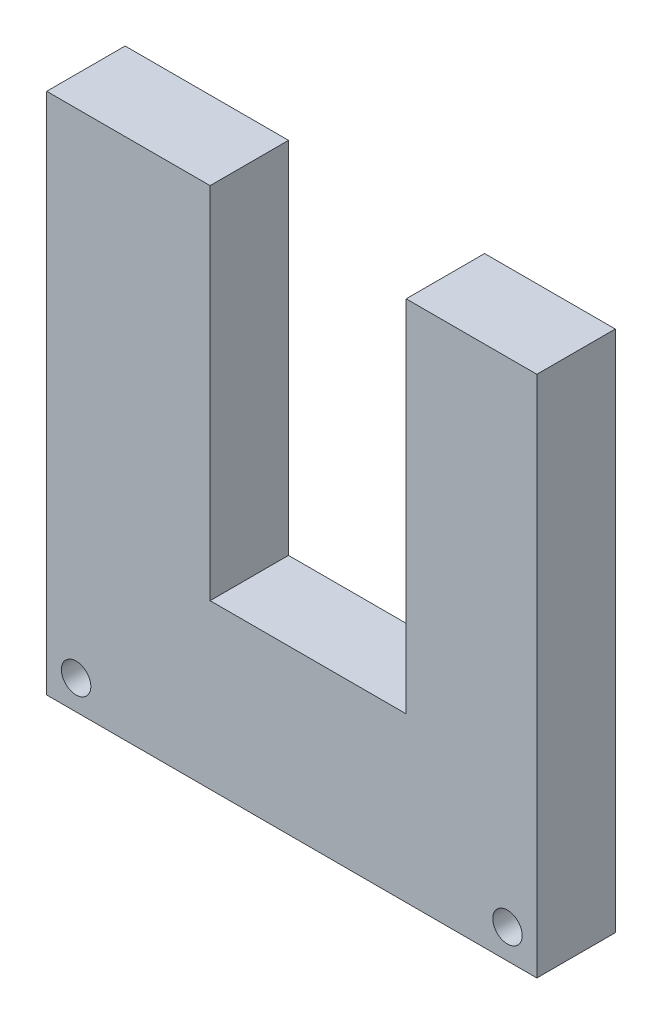
ISO-10303-21;
HEADER;
FILE_DESCRIPTION(('STEP AP214'),'2;1');
FILE_NAME('part.step','',(''),(''),'','','');
FILE_SCHEMA(('AUTOMOTIVE_DESIGN { 1 0 10303 214 1 1 1 1 }'));
ENDSEC;
DATA;
#1=APPLICATION_CONTEXT('core data for automotive mechanical design processes');
#2=APPLICATION_PROTOCOL_DEFINITION('international standard','automotive_design',2000,#1);
#3=PRODUCT_CONTEXT('',#1,'mechanical');
#4=PRODUCT('Part','Part','',(#3));
#5=PRODUCT_RELATED_PRODUCT_CATEGORY('part','',(#4));
#6=PRODUCT_DEFINITION_FORMATION('','',#4);
#7=PRODUCT_DEFINITION_CONTEXT('part definition',#1,'design');
#8=PRODUCT_DEFINITION('design','',#6,#7);
#9=PRODUCT_DEFINITION_SHAPE('','',#8);
#10=(LENGTH_UNIT() NAMED_UNIT(*) SI_UNIT(.MILLI.,.METRE.));
#11=(NAMED_UNIT(*) PLANE_ANGLE_UNIT() SI_UNIT($,.RADIAN.));
#12=(NAMED_UNIT(*) SI_UNIT($,.STERADIAN.) SOLID_ANGLE_UNIT());
#13=UNCERTAINTY_MEASURE_WITH_UNIT(LENGTH_MEASURE(1.E-05),#10,'distance_accuracy_value','');
#14=(GEOMETRIC_REPRESENTATION_CONTEXT(3) GLOBAL_UNCERTAINTY_ASSIGNED_CONTEXT((#13)) GLOBAL_UNIT_ASSIGNED_CONTEXT((#10,
#11,#12)) REPRESENTATION_CONTEXT('',''));
#15=CARTESIAN_POINT('',(0.,0.,0.));
#16=DIRECTION('',(0.,0.,1.));
#17=DIRECTION('',(1.,0.,0.));
#18=AXIS2_PLACEMENT_3D('',#15,#16,#17);
#19=CARTESIAN_POINT('',(0.,0.,12.));
#20=DIRECTION('',(0.,0.,-1.));
#21=DIRECTION('',(-1.,0.,0.));
#22=AXIS2_PLACEMENT_3D('',#19,#20,#21);
#23=PLANE('',#22);
#24=CARTESIAN_POINT('',(70.5,4.49999999999999,12.));
#25=DIRECTION('',(0.,0.,1.));
#26=DIRECTION('',(1.,0.,0.));
#27=AXIS2_PLACEMENT_3D('',#24,#25,#26);
#28=CIRCLE('',#27,2.25);
#29=CARTESIAN_POINT('',(72.75,4.49999999999999,12.));
#30=VERTEX_POINT('',#29);
#31=EDGE_CURVE('E134',#30,#30,#28,.T.);
#32=ORIENTED_EDGE('',*,*,#31,.F.);
#33=EDGE_LOOP('',(#32));
#34=FACE_BOUND('',#33,.T.);
#35=DIRECTION('',(1.,0.,0.));
#36=VECTOR('',#35,1.);
#37=CARTESIAN_POINT('',(75.,0.,12.));
#38=LINE('',#37,#36);
#39=CARTESIAN_POINT('',(0.,0.,12.));
#40=VERTEX_POINT('',#39);
#41=CARTESIAN_POINT('',(75.,0.,12.));
#42=VERTEX_POINT('',#41);
#43=EDGE_CURVE('E145',#40,#42,#38,.T.);
#44=ORIENTED_EDGE('',*,*,#43,.T.);
#45=DIRECTION('',(0.,1.,0.));
#46=VECTOR('',#45,1.);
#47=CARTESIAN_POINT('',(75.,80.,12.));
#48=LINE('',#47,#46);
#49=CARTESIAN_POINT('',(75.,80.,12.));
#50=VERTEX_POINT('',#49);
#51=EDGE_CURVE('E93',#42,#50,#48,.T.);
#52=ORIENTED_EDGE('',*,*,#51,.T.);
#53=DIRECTION('',(-1.,0.,0.));
#54=VECTOR('',#53,1.);
#55=CARTESIAN_POINT('',(55.,80.,12.));
#56=LINE('',#55,#54);
#57=CARTESIAN_POINT('',(55.,80.,12.));
#58=VERTEX_POINT('',#57);
#59=EDGE_CURVE('E160',#50,#58,#56,.T.);
#60=ORIENTED_EDGE('',*,*,#59,.T.);
#61=DIRECTION('',(0.,-1.,0.));
#62=VECTOR('',#61,1.);
#63=CARTESIAN_POINT('',(55.,25.,12.));
#64=LINE('',#63,#62);
#65=CARTESIAN_POINT('',(55.,25.,12.));
#66=VERTEX_POINT('',#65);
#67=EDGE_CURVE('E173',#58,#66,#64,.T.);
#68=ORIENTED_EDGE('',*,*,#67,.T.);
#69=DIRECTION('',(-1.,0.,0.));
#70=VECTOR('',#69,1.);
#71=CARTESIAN_POINT('',(25.,25.,12.));
#72=LINE('',#71,#70);
#73=CARTESIAN_POINT('',(25.,25.,12.));
#74=VERTEX_POINT('',#73);
#75=EDGE_CURVE('E112',#66,#74,#72,.T.);
#76=ORIENTED_EDGE('',*,*,#75,.T.);
#77=DIRECTION('',(0.,1.,0.));
#78=VECTOR('',#77,1.);
#79=CARTESIAN_POINT('',(25.,80.,12.));
#80=LINE('',#79,#78);
#81=CARTESIAN_POINT('',(25.,80.,12.));
#82=VERTEX_POINT('',#81);
#83=EDGE_CURVE('E106',#74,#82,#80,.T.);
#84=ORIENTED_EDGE('',*,*,#83,.T.);
#85=DIRECTION('',(-1.,0.,0.));
#86=VECTOR('',#85,1.);
#87=CARTESIAN_POINT('',(0.,80.,12.));
#88=LINE('',#87,#86);
#89=CARTESIAN_POINT('',(0.,80.,12.));
#90=VERTEX_POINT('',#89);
#91=EDGE_CURVE('E110',#82,#90,#88,.T.);
#92=ORIENTED_EDGE('',*,*,#91,.T.);
#93=DIRECTION('',(0.,-1.,0.));
#94=VECTOR('',#93,1.);
#95=CARTESIAN_POINT('',(0.,0.,12.));
#96=LINE('',#95,#94);
#97=EDGE_CURVE('E50',#90,#40,#96,.T.);
#98=ORIENTED_EDGE('',*,*,#97,.T.);
#99=EDGE_LOOP('',(#44,#52,#60,#68,#76,#84,#92,#98));
#100=FACE_BOUND('',#99,.T.);
#101=CARTESIAN_POINT('',(4.5,4.49999999999999,12.));
#102=DIRECTION('',(0.,0.,1.));
#103=DIRECTION('',(1.,0.,0.));
#104=AXIS2_PLACEMENT_3D('',#101,#102,#103);
#105=CIRCLE('',#104,2.25);
#106=CARTESIAN_POINT('',(6.75,4.49999999999999,12.));
#107=VERTEX_POINT('',#106);
#108=EDGE_CURVE('E182',#107,#107,#105,.T.);
#109=ORIENTED_EDGE('',*,*,#108,.F.);
#110=EDGE_LOOP('',(#109));
#111=FACE_BOUND('',#110,.T.);
#112=ADVANCED_FACE('F33',(#34,#100,#111),#23,.F.);
#113=CARTESIAN_POINT('',(0.,0.,0.));
#114=DIRECTION('',(0.,0.,-1.));
#115=DIRECTION('',(-1.,0.,0.));
#116=AXIS2_PLACEMENT_3D('',#113,#114,#115);
#117=PLANE('',#116);
#118=CARTESIAN_POINT('',(70.5,4.49999999999999,0.));
#119=DIRECTION('',(0.,0.,1.));
#120=DIRECTION('',(1.,0.,0.));
#121=AXIS2_PLACEMENT_3D('',#118,#119,#120);
#122=CIRCLE('',#121,2.25);
#123=CARTESIAN_POINT('',(72.75,4.49999999999999,0.));
#124=VERTEX_POINT('',#123);
#125=EDGE_CURVE('E179',#124,#124,#122,.T.);
#126=ORIENTED_EDGE('',*,*,#125,.T.);
#127=EDGE_LOOP('',(#126));
#128=FACE_BOUND('',#127,.T.);
#129=DIRECTION('',(1.,0.,0.));
#130=VECTOR('',#129,1.);
#131=CARTESIAN_POINT('',(75.,0.,0.));
#132=LINE('',#131,#130);
#133=CARTESIAN_POINT('',(0.,0.,0.));
#134=VERTEX_POINT('',#133);
#135=CARTESIAN_POINT('',(75.,0.,0.));
#136=VERTEX_POINT('',#135);
#137=EDGE_CURVE('E130',#134,#136,#132,.T.);
#138=ORIENTED_EDGE('',*,*,#137,.F.);
#139=DIRECTION('',(0.,-1.,0.));
#140=VECTOR('',#139,1.);
#141=CARTESIAN_POINT('',(0.,0.,0.));
#142=LINE('',#141,#140);
#143=CARTESIAN_POINT('',(0.,80.,0.));
#144=VERTEX_POINT('',#143);
#145=EDGE_CURVE('E85',#144,#134,#142,.T.);
#146=ORIENTED_EDGE('',*,*,#145,.F.);
#147=DIRECTION('',(-1.,0.,0.));
#148=VECTOR('',#147,1.);
#149=CARTESIAN_POINT('',(0.,80.,0.));
#150=LINE('',#149,#148);
#151=CARTESIAN_POINT('',(25.,80.,0.));
#152=VERTEX_POINT('',#151);
#153=EDGE_CURVE('E79',#152,#144,#150,.T.);
#154=ORIENTED_EDGE('',*,*,#153,.F.);
#155=DIRECTION('',(0.,1.,0.));
#156=VECTOR('',#155,1.);
#157=CARTESIAN_POINT('',(25.,80.,0.));
#158=LINE('',#157,#156);
#159=CARTESIAN_POINT('',(25.,25.,0.));
#160=VERTEX_POINT('',#159);
#161=EDGE_CURVE('E120',#160,#152,#158,.T.);
#162=ORIENTED_EDGE('',*,*,#161,.F.);
#163=DIRECTION('',(-1.,0.,0.));
#164=VECTOR('',#163,1.);
#165=CARTESIAN_POINT('',(25.,25.,0.));
#166=LINE('',#165,#164);
#167=CARTESIAN_POINT('',(55.,25.,0.));
#168=VERTEX_POINT('',#167);
#169=EDGE_CURVE('E140',#168,#160,#166,.T.);
#170=ORIENTED_EDGE('',*,*,#169,.F.);
#171=DIRECTION('',(0.,-1.,0.));
#172=VECTOR('',#171,1.);
#173=CARTESIAN_POINT('',(55.,25.,0.));
#174=LINE('',#173,#172);
#175=CARTESIAN_POINT('',(55.,80.,0.));
#176=VERTEX_POINT('',#175);
#177=EDGE_CURVE('E138',#176,#168,#174,.T.);
#178=ORIENTED_EDGE('',*,*,#177,.F.);
#179=DIRECTION('',(-1.,0.,0.));
#180=VECTOR('',#179,1.);
#181=CARTESIAN_POINT('',(55.,80.,0.));
#182=LINE('',#181,#180);
#183=CARTESIAN_POINT('',(75.,80.,0.));
#184=VERTEX_POINT('',#183);
#185=EDGE_CURVE('E136',#184,#176,#182,.T.);
#186=ORIENTED_EDGE('',*,*,#185,.F.);
#187=DIRECTION('',(0.,1.,0.));
#188=VECTOR('',#187,1.);
#189=CARTESIAN_POINT('',(75.,80.,0.));
#190=LINE('',#189,#188);
#191=EDGE_CURVE('E133',#136,#184,#190,.T.);
#192=ORIENTED_EDGE('',*,*,#191,.F.);
#193=EDGE_LOOP('',(#138,#146,#154,#162,#170,#178,#186,#192));
#194=FACE_BOUND('',#193,.T.);
#195=CARTESIAN_POINT('',(4.5,4.49999999999999,0.));
#196=DIRECTION('',(0.,0.,1.));
#197=DIRECTION('',(1.,0.,0.));
#198=AXIS2_PLACEMENT_3D('',#195,#196,#197);
#199=CIRCLE('',#198,2.25);
#200=CARTESIAN_POINT('',(6.75,4.49999999999999,0.));
#201=VERTEX_POINT('',#200);
#202=EDGE_CURVE('E185',#201,#201,#199,.T.);
#203=ORIENTED_EDGE('',*,*,#202,.T.);
#204=EDGE_LOOP('',(#203));
#205=FACE_BOUND('',#204,.T.);
#206=ADVANCED_FACE('F164',(#128,#194,#205),#117,.T.);
#207=CARTESIAN_POINT('',(75.,0.,12.));
#208=DIRECTION('',(0.,1.,0.));
#209=DIRECTION('',(-1.,0.,0.));
#210=AXIS2_PLACEMENT_3D('',#207,#208,#209);
#211=PLANE('',#210);
#212=ORIENTED_EDGE('',*,*,#137,.T.);
#213=DIRECTION('',(0.,0.,-1.));
#214=VECTOR('',#213,1.);
#215=CARTESIAN_POINT('',(75.,0.,12.));
#216=LINE('',#215,#214);
#217=EDGE_CURVE('E11',#42,#136,#216,.T.);
#218=ORIENTED_EDGE('',*,*,#217,.F.);
#219=ORIENTED_EDGE('',*,*,#43,.F.);
#220=DIRECTION('',(0.,0.,-1.));
#221=VECTOR('',#220,1.);
#222=CARTESIAN_POINT('',(0.,0.,12.));
#223=LINE('',#222,#221);
#224=EDGE_CURVE('E126',#40,#134,#223,.T.);
#225=ORIENTED_EDGE('',*,*,#224,.T.);
#226=EDGE_LOOP('',(#212,#218,#219,#225));
#227=FACE_BOUND('',#226,.T.);
#228=ADVANCED_FACE('F35',(#227),#211,.F.);
#229=CARTESIAN_POINT('',(75.,80.,12.));
#230=DIRECTION('',(-1.,0.,0.));
#231=DIRECTION('',(0.,-1.,0.));
#232=AXIS2_PLACEMENT_3D('',#229,#230,#231);
#233=PLANE('',#232);
#234=ORIENTED_EDGE('',*,*,#191,.T.);
#235=DIRECTION('',(0.,0.,-1.));
#236=VECTOR('',#235,1.);
#237=CARTESIAN_POINT('',(75.,80.,12.));
#238=LINE('',#237,#236);
#239=EDGE_CURVE('E42',#50,#184,#238,.T.);
#240=ORIENTED_EDGE('',*,*,#239,.F.);
#241=ORIENTED_EDGE('',*,*,#51,.F.);
#242=ORIENTED_EDGE('',*,*,#217,.T.);
#243=EDGE_LOOP('',(#234,#240,#241,#242));
#244=FACE_BOUND('',#243,.T.);
#245=ADVANCED_FACE('F218',(#244),#233,.F.);
#246=CARTESIAN_POINT('',(55.,80.,12.));
#247=DIRECTION('',(0.,-1.,0.));
#248=DIRECTION('',(0.,0.,-1.));
#249=AXIS2_PLACEMENT_3D('',#246,#247,#248);
#250=PLANE('',#249);
#251=ORIENTED_EDGE('',*,*,#185,.T.);
#252=DIRECTION('',(0.,0.,-1.));
#253=VECTOR('',#252,1.);
#254=CARTESIAN_POINT('',(55.,80.,12.));
#255=LINE('',#254,#253);
#256=EDGE_CURVE('E152',#58,#176,#255,.T.);
#257=ORIENTED_EDGE('',*,*,#256,.F.);
#258=ORIENTED_EDGE('',*,*,#59,.F.);
#259=ORIENTED_EDGE('',*,*,#239,.T.);
#260=EDGE_LOOP('',(#251,#257,#258,#259));
#261=FACE_BOUND('',#260,.T.);
#262=ADVANCED_FACE('F158',(#261),#250,.F.);
#263=CARTESIAN_POINT('',(55.,25.,12.));
#264=DIRECTION('',(1.,0.,0.));
#265=DIRECTION('',(0.,0.,-1.));
#266=AXIS2_PLACEMENT_3D('',#263,#264,#265);
#267=PLANE('',#266);
#268=ORIENTED_EDGE('',*,*,#177,.T.);
#269=DIRECTION('',(0.,0.,-1.));
#270=VECTOR('',#269,1.);
#271=CARTESIAN_POINT('',(55.,25.,12.));
#272=LINE('',#271,#270);
#273=EDGE_CURVE('E149',#66,#168,#272,.T.);
#274=ORIENTED_EDGE('',*,*,#273,.F.);
#275=ORIENTED_EDGE('',*,*,#67,.F.);
#276=ORIENTED_EDGE('',*,*,#256,.T.);
#277=EDGE_LOOP('',(#268,#274,#275,#276));
#278=FACE_BOUND('',#277,.T.);
#279=ADVANCED_FACE('F169',(#278),#267,.F.);
#280=CARTESIAN_POINT('',(25.,25.,12.));
#281=DIRECTION('',(0.,-1.,0.));
#282=DIRECTION('',(0.,0.,-1.));
#283=AXIS2_PLACEMENT_3D('',#280,#281,#282);
#284=PLANE('',#283);
#285=ORIENTED_EDGE('',*,*,#169,.T.);
#286=DIRECTION('',(0.,0.,-1.));
#287=VECTOR('',#286,1.);
#288=CARTESIAN_POINT('',(25.,25.,12.));
#289=LINE('',#288,#287);
#290=EDGE_CURVE('E121',#74,#160,#289,.T.);
#291=ORIENTED_EDGE('',*,*,#290,.F.);
#292=ORIENTED_EDGE('',*,*,#75,.F.);
#293=ORIENTED_EDGE('',*,*,#273,.T.);
#294=EDGE_LOOP('',(#285,#291,#292,#293));
#295=FACE_BOUND('',#294,.T.);
#296=ADVANCED_FACE('F172',(#295),#284,.F.);
#297=CARTESIAN_POINT('',(25.,80.,12.));
#298=DIRECTION('',(-1.,0.,0.));
#299=DIRECTION('',(0.,-1.,0.));
#300=AXIS2_PLACEMENT_3D('',#297,#298,#299);
#301=PLANE('',#300);
#302=ORIENTED_EDGE('',*,*,#161,.T.);
#303=DIRECTION('',(0.,0.,-1.));
#304=VECTOR('',#303,1.);
#305=CARTESIAN_POINT('',(25.,80.,12.));
#306=LINE('',#305,#304);
#307=EDGE_CURVE('E117',#82,#152,#306,.T.);
#308=ORIENTED_EDGE('',*,*,#307,.F.);
#309=ORIENTED_EDGE('',*,*,#83,.F.);
#310=ORIENTED_EDGE('',*,*,#290,.T.);
#311=EDGE_LOOP('',(#302,#308,#309,#310));
#312=FACE_BOUND('',#311,.T.);
#313=ADVANCED_FACE('F118',(#312),#301,.F.);
#314=CARTESIAN_POINT('',(0.,80.,12.));
#315=DIRECTION('',(0.,-1.,0.));
#316=DIRECTION('',(0.,0.,-1.));
#317=AXIS2_PLACEMENT_3D('',#314,#315,#316);
#318=PLANE('',#317);
#319=ORIENTED_EDGE('',*,*,#153,.T.);
#320=DIRECTION('',(0.,0.,-1.));
#321=VECTOR('',#320,1.);
#322=CARTESIAN_POINT('',(0.,80.,12.));
#323=LINE('',#322,#321);
#324=EDGE_CURVE('E122',#90,#144,#323,.T.);
#325=ORIENTED_EDGE('',*,*,#324,.F.);
#326=ORIENTED_EDGE('',*,*,#91,.F.);
#327=ORIENTED_EDGE('',*,*,#307,.T.);
#328=EDGE_LOOP('',(#319,#325,#326,#327));
#329=FACE_BOUND('',#328,.T.);
#330=ADVANCED_FACE('F124',(#329),#318,.F.);
#331=CARTESIAN_POINT('',(0.,0.,12.));
#332=DIRECTION('',(1.,0.,0.));
#333=DIRECTION('',(0.,0.,-1.));
#334=AXIS2_PLACEMENT_3D('',#331,#332,#333);
#335=PLANE('',#334);
#336=ORIENTED_EDGE('',*,*,#145,.T.);
#337=ORIENTED_EDGE('',*,*,#224,.F.);
#338=ORIENTED_EDGE('',*,*,#97,.F.);
#339=ORIENTED_EDGE('',*,*,#324,.T.);
#340=EDGE_LOOP('',(#336,#337,#338,#339));
#341=FACE_BOUND('',#340,.T.);
#342=ADVANCED_FACE('F206',(#341),#335,.F.);
#343=CARTESIAN_POINT('',(70.5,4.49999999999999,12.));
#344=DIRECTION('',(0.,0.,-1.));
#345=DIRECTION('',(-1.,0.,0.));
#346=AXIS2_PLACEMENT_3D('',#343,#344,#345);
#347=CYLINDRICAL_SURFACE('',#346,2.25);
#348=ORIENTED_EDGE('',*,*,#31,.T.);
#349=EDGE_LOOP('',(#348));
#350=FACE_BOUND('',#349,.T.);
#351=ORIENTED_EDGE('',*,*,#125,.F.);
#352=EDGE_LOOP('',(#351));
#353=FACE_BOUND('',#352,.T.);
#354=ADVANCED_FACE('F203',(#350,#353),#347,.F.);
#355=CARTESIAN_POINT('',(4.5,4.49999999999999,12.));
#356=DIRECTION('',(0.,0.,-1.));
#357=DIRECTION('',(-1.,0.,0.));
#358=AXIS2_PLACEMENT_3D('',#355,#356,#357);
#359=CYLINDRICAL_SURFACE('',#358,2.25);
#360=ORIENTED_EDGE('',*,*,#108,.T.);
#361=EDGE_LOOP('',(#360));
#362=FACE_BOUND('',#361,.T.);
#363=ORIENTED_EDGE('',*,*,#202,.F.);
#364=EDGE_LOOP('',(#363));
#365=FACE_BOUND('',#364,.T.);
#366=ADVANCED_FACE('F191',(#362,#365),#359,.F.);
#367=CLOSED_SHELL('',(#112,#206,#228,#245,#262,#279,#296,#313,#330,#342,#354,#366));
#368=MANIFOLD_SOLID_BREP('B2',#367);
#369=ADVANCED_BREP_SHAPE_REPRESENTATION('',(#18,#368),#14);
#370=SHAPE_DEFINITION_REPRESENTATION(#9,#369);
ENDSEC;
END-ISO-10303-21;
